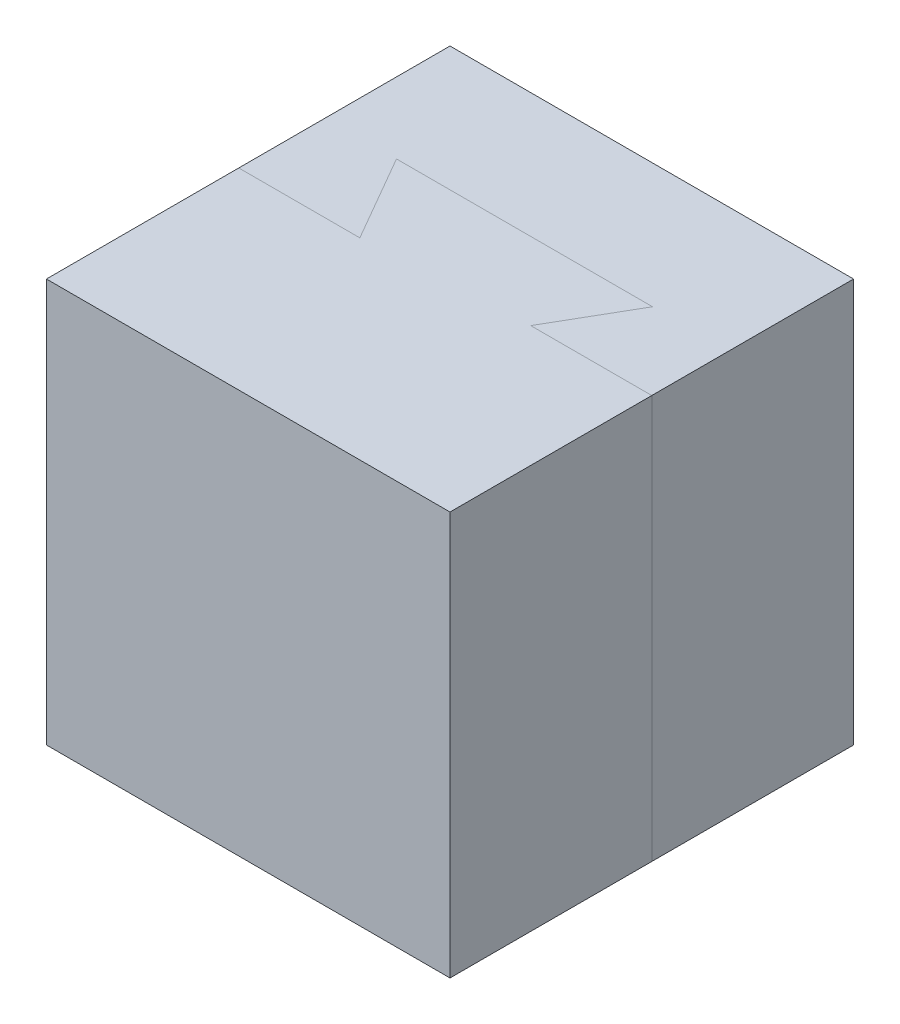
ISO-10303-21;
HEADER;
FILE_DESCRIPTION(('STEP AP214'),'2;1');
FILE_NAME('part.step','',(''),(''),'','','');
FILE_SCHEMA(('AUTOMOTIVE_DESIGN { 1 0 10303 214 1 1 1 1 }'));
ENDSEC;
DATA;
#1=APPLICATION_CONTEXT('core data for automotive mechanical design processes');
#2=APPLICATION_PROTOCOL_DEFINITION('international standard','automotive_design',2000,#1);
#3=PRODUCT_CONTEXT('',#1,'mechanical');
#4=PRODUCT('Part','Part','',(#3));
#5=PRODUCT_RELATED_PRODUCT_CATEGORY('part','',(#4));
#6=PRODUCT_DEFINITION_FORMATION('','',#4);
#7=PRODUCT_DEFINITION_CONTEXT('part definition',#1,'design');
#8=PRODUCT_DEFINITION('design','',#6,#7);
#9=PRODUCT_DEFINITION_SHAPE('','',#8);
#10=(LENGTH_UNIT() NAMED_UNIT(*) SI_UNIT(.MILLI.,.METRE.));
#11=(NAMED_UNIT(*) PLANE_ANGLE_UNIT() SI_UNIT($,.RADIAN.));
#12=(NAMED_UNIT(*) SI_UNIT($,.STERADIAN.) SOLID_ANGLE_UNIT());
#13=UNCERTAINTY_MEASURE_WITH_UNIT(LENGTH_MEASURE(1.E-05),#10,'distance_accuracy_value','');
#14=(GEOMETRIC_REPRESENTATION_CONTEXT(3) GLOBAL_UNCERTAINTY_ASSIGNED_CONTEXT((#13)) GLOBAL_UNIT_ASSIGNED_CONTEXT((#10,
#11,#12)) REPRESENTATION_CONTEXT('',''));
#15=CARTESIAN_POINT('',(0.,0.,0.));
#16=DIRECTION('',(0.,0.,1.));
#17=DIRECTION('',(1.,0.,0.));
#18=AXIS2_PLACEMENT_3D('',#15,#16,#17);
#19=CARTESIAN_POINT('',(-5.,-0.00999999999999959,0.234054964457145));
#20=DIRECTION('',(0.,0.,-1.));
#21=DIRECTION('',(-1.,0.,0.));
#22=AXIS2_PLACEMENT_3D('',#19,#20,#21);
#23=PLANE('',#22);
#24=DIRECTION('',(0.,1.,0.));
#25=VECTOR('',#24,1.);
#26=CARTESIAN_POINT('',(-2.,-0.00999999999999959,0.234054964457145));
#27=LINE('',#26,#25);
#28=CARTESIAN_POINT('',(-2.,0.,0.234054964457145));
#29=VERTEX_POINT('',#28);
#30=CARTESIAN_POINT('',(-2.,10.,0.234054964457145));
#31=VERTEX_POINT('',#30);
#32=EDGE_CURVE('E12',#29,#31,#27,.T.);
#33=ORIENTED_EDGE('',*,*,#32,.F.);
#34=DIRECTION('',(-1.,0.,0.));
#35=VECTOR('',#34,1.);
#36=CARTESIAN_POINT('',(0.,0.,0.234054964457145));
#37=LINE('',#36,#35);
#38=CARTESIAN_POINT('',(-5.,0.,0.234054964457145));
#39=VERTEX_POINT('',#38);
#40=EDGE_CURVE('E169',#29,#39,#37,.T.);
#41=ORIENTED_EDGE('',*,*,#40,.T.);
#42=DIRECTION('',(0.,1.,0.));
#43=VECTOR('',#42,1.);
#44=CARTESIAN_POINT('',(-5.,10.,0.234054964457145));
#45=LINE('',#44,#43);
#46=CARTESIAN_POINT('',(-5.,10.,0.234054964457145));
#47=VERTEX_POINT('',#46);
#48=EDGE_CURVE('E146',#39,#47,#45,.T.);
#49=ORIENTED_EDGE('',*,*,#48,.T.);
#50=DIRECTION('',(-1.,0.,0.));
#51=VECTOR('',#50,1.);
#52=CARTESIAN_POINT('',(0.,10.,0.234054964457145));
#53=LINE('',#52,#51);
#54=EDGE_CURVE('E194',#31,#47,#53,.T.);
#55=ORIENTED_EDGE('',*,*,#54,.F.);
#56=EDGE_LOOP('',(#33,#41,#49,#55));
#57=FACE_BOUND('',#56,.T.);
#58=ADVANCED_FACE('F55',(#57),#23,.T.);
#59=CARTESIAN_POINT('',(-2.,-0.00999999999999959,0.234054964457145));
#60=DIRECTION('',(-0.866025403784436,0.,0.500000000000004));
#61=DIRECTION('',(0.500000000000004,0.,0.866025403784436));
#62=AXIS2_PLACEMENT_3D('',#59,#60,#61);
#63=PLANE('',#62);
#64=DIRECTION('',(0.,1.,0.));
#65=VECTOR('',#64,1.);
#66=CARTESIAN_POINT('',(-3.2399584674678,-0.00999999999999959,-1.9136161004723));
#67=LINE('',#66,#65);
#68=CARTESIAN_POINT('',(-3.2399584674678,0.,-1.9136161004723));
#69=VERTEX_POINT('',#68);
#70=CARTESIAN_POINT('',(-3.2399584674678,10.,-1.9136161004723));
#71=VERTEX_POINT('',#70);
#72=EDGE_CURVE('E66',#69,#71,#67,.T.);
#73=ORIENTED_EDGE('',*,*,#72,.F.);
#74=DIRECTION('',(0.500000000000004,0.,0.866025403784436));
#75=VECTOR('',#74,1.);
#76=CARTESIAN_POINT('',(-1.60134877255087,0.,0.924539144898731));
#77=LINE('',#76,#75);
#78=EDGE_CURVE('E165',#69,#29,#77,.T.);
#79=ORIENTED_EDGE('',*,*,#78,.T.);
#80=ORIENTED_EDGE('',*,*,#32,.T.);
#81=DIRECTION('',(0.500000000000004,0.,0.866025403784436));
#82=VECTOR('',#81,1.);
#83=CARTESIAN_POINT('',(-1.60134877255087,10.,0.924539144898731));
#84=LINE('',#83,#82);
#85=EDGE_CURVE('E198',#71,#31,#84,.T.);
#86=ORIENTED_EDGE('',*,*,#85,.F.);
#87=EDGE_LOOP('',(#73,#79,#80,#86));
#88=FACE_BOUND('',#87,.T.);
#89=ADVANCED_FACE('F220',(#88),#63,.T.);
#90=CARTESIAN_POINT('',(-3.2399584674678,-0.00999999999999959,-1.9136161004723));
#91=DIRECTION('',(0.,0.,-1.));
#92=DIRECTION('',(-1.,0.,0.));
#93=AXIS2_PLACEMENT_3D('',#90,#91,#92);
#94=PLANE('',#93);
#95=DIRECTION('',(0.,1.,0.));
#96=VECTOR('',#95,1.);
#97=CARTESIAN_POINT('',(3.1048267707333,-0.00999999999999959,-1.9136161004723));
#98=LINE('',#97,#96);
#99=CARTESIAN_POINT('',(3.1048267707333,0.,-1.9136161004723));
#100=VERTEX_POINT('',#99);
#101=CARTESIAN_POINT('',(3.1048267707333,10.,-1.9136161004723));
#102=VERTEX_POINT('',#101);
#103=EDGE_CURVE('E189',#100,#102,#98,.T.);
#104=ORIENTED_EDGE('',*,*,#103,.F.);
#105=DIRECTION('',(-1.,0.,0.));
#106=VECTOR('',#105,1.);
#107=CARTESIAN_POINT('',(0.,0.,-1.9136161004723));
#108=LINE('',#107,#106);
#109=EDGE_CURVE('E159',#100,#69,#108,.T.);
#110=ORIENTED_EDGE('',*,*,#109,.T.);
#111=ORIENTED_EDGE('',*,*,#72,.T.);
#112=DIRECTION('',(-1.,0.,0.));
#113=VECTOR('',#112,1.);
#114=CARTESIAN_POINT('',(0.,10.,-1.9136161004723));
#115=LINE('',#114,#113);
#116=EDGE_CURVE('E202',#102,#71,#115,.T.);
#117=ORIENTED_EDGE('',*,*,#116,.F.);
#118=EDGE_LOOP('',(#104,#110,#111,#117));
#119=FACE_BOUND('',#118,.T.);
#120=ADVANCED_FACE('F216',(#119),#94,.T.);
#121=CARTESIAN_POINT('',(3.1048267707333,-0.00999999999999959,-1.9136161004723));
#122=DIRECTION('',(0.866025403784436,0.,0.500000000000004));
#123=DIRECTION('',(0.500000000000004,0.,-0.866025403784436));
#124=AXIS2_PLACEMENT_3D('',#121,#122,#123);
#125=PLANE('',#124);
#126=DIRECTION('',(0.,1.,0.));
#127=VECTOR('',#126,1.);
#128=CARTESIAN_POINT('',(2.,-0.00999999999999959,0.));
#129=LINE('',#128,#127);
#130=CARTESIAN_POINT('',(2.,0.,0.));
#131=VERTEX_POINT('',#130);
#132=CARTESIAN_POINT('',(2.,10.,0.));
#133=VERTEX_POINT('',#132);
#134=EDGE_CURVE('E138',#131,#133,#129,.T.);
#135=ORIENTED_EDGE('',*,*,#134,.F.);
#136=DIRECTION('',(0.500000000000004,0.,-0.866025403784436));
#137=VECTOR('',#136,1.);
#138=CARTESIAN_POINT('',(1.49999999999999,0.,0.866025403784443));
#139=LINE('',#138,#137);
#140=EDGE_CURVE('E152',#131,#100,#139,.T.);
#141=ORIENTED_EDGE('',*,*,#140,.T.);
#142=ORIENTED_EDGE('',*,*,#103,.T.);
#143=DIRECTION('',(0.500000000000004,0.,-0.866025403784436));
#144=VECTOR('',#143,1.);
#145=CARTESIAN_POINT('',(1.49999999999999,10.,0.866025403784443));
#146=LINE('',#145,#144);
#147=EDGE_CURVE('E206',#133,#102,#146,.T.);
#148=ORIENTED_EDGE('',*,*,#147,.F.);
#149=EDGE_LOOP('',(#135,#141,#142,#148));
#150=FACE_BOUND('',#149,.T.);
#151=ADVANCED_FACE('F214',(#150),#125,.T.);
#152=CARTESIAN_POINT('',(2.,-0.00999999999999959,0.));
#153=DIRECTION('',(0.,0.,-1.));
#154=DIRECTION('',(-1.,0.,0.));
#155=AXIS2_PLACEMENT_3D('',#152,#153,#154);
#156=PLANE('',#155);
#157=DIRECTION('',(0.,-1.,0.));
#158=VECTOR('',#157,1.);
#159=CARTESIAN_POINT('',(5.,10.,0.));
#160=LINE('',#159,#158);
#161=CARTESIAN_POINT('',(5.,10.,0.));
#162=VERTEX_POINT('',#161);
#163=CARTESIAN_POINT('',(5.,0.,0.));
#164=VERTEX_POINT('',#163);
#165=EDGE_CURVE('E132',#162,#164,#160,.T.);
#166=ORIENTED_EDGE('',*,*,#165,.T.);
#167=DIRECTION('',(-1.,0.,0.));
#168=VECTOR('',#167,1.);
#169=CARTESIAN_POINT('',(0.,0.,0.));
#170=LINE('',#169,#168);
#171=EDGE_CURVE('E142',#164,#131,#170,.T.);
#172=ORIENTED_EDGE('',*,*,#171,.T.);
#173=ORIENTED_EDGE('',*,*,#134,.T.);
#174=DIRECTION('',(-1.,0.,0.));
#175=VECTOR('',#174,1.);
#176=CARTESIAN_POINT('',(0.,10.,0.));
#177=LINE('',#176,#175);
#178=EDGE_CURVE('E144',#162,#133,#177,.T.);
#179=ORIENTED_EDGE('',*,*,#178,.F.);
#180=EDGE_LOOP('',(#166,#172,#173,#179));
#181=FACE_BOUND('',#180,.T.);
#182=ADVANCED_FACE('F141',(#181),#156,.T.);
#183=CARTESIAN_POINT('',(0.,0.,0.));
#184=DIRECTION('',(0.,1.,0.));
#185=DIRECTION('',(0.,0.,1.));
#186=AXIS2_PLACEMENT_3D('',#183,#184,#185);
#187=PLANE('',#186);
#188=ORIENTED_EDGE('',*,*,#171,.F.);
#189=DIRECTION('',(0.,0.,-1.));
#190=VECTOR('',#189,1.);
#191=CARTESIAN_POINT('',(5.,0.,-5.));
#192=LINE('',#191,#190);
#193=CARTESIAN_POINT('',(5.,0.,5.));
#194=VERTEX_POINT('',#193);
#195=EDGE_CURVE('E59',#194,#164,#192,.T.);
#196=ORIENTED_EDGE('',*,*,#195,.F.);
#197=DIRECTION('',(1.,0.,0.));
#198=VECTOR('',#197,1.);
#199=CARTESIAN_POINT('',(-5.,0.,5.));
#200=LINE('',#199,#198);
#201=CARTESIAN_POINT('',(-5.,0.,5.));
#202=VERTEX_POINT('',#201);
#203=EDGE_CURVE('E177',#202,#194,#200,.T.);
#204=ORIENTED_EDGE('',*,*,#203,.F.);
#205=DIRECTION('',(0.,0.,1.));
#206=VECTOR('',#205,1.);
#207=CARTESIAN_POINT('',(-5.,0.,-5.));
#208=LINE('',#207,#206);
#209=EDGE_CURVE('E75',#39,#202,#208,.T.);
#210=ORIENTED_EDGE('',*,*,#209,.F.);
#211=ORIENTED_EDGE('',*,*,#40,.F.);
#212=ORIENTED_EDGE('',*,*,#78,.F.);
#213=ORIENTED_EDGE('',*,*,#109,.F.);
#214=ORIENTED_EDGE('',*,*,#140,.F.);
#215=EDGE_LOOP('',(#188,#196,#204,#210,#211,#212,#213,#214));
#216=FACE_BOUND('',#215,.T.);
#217=ADVANCED_FACE('F149',(#216),#187,.F.);
#218=CARTESIAN_POINT('',(5.,10.,-5.));
#219=DIRECTION('',(-1.,0.,0.));
#220=DIRECTION('',(0.,0.,1.));
#221=AXIS2_PLACEMENT_3D('',#218,#219,#220);
#222=PLANE('',#221);
#223=ORIENTED_EDGE('',*,*,#165,.F.);
#224=DIRECTION('',(0.,0.,-1.));
#225=VECTOR('',#224,1.);
#226=CARTESIAN_POINT('',(5.,10.,-5.));
#227=LINE('',#226,#225);
#228=CARTESIAN_POINT('',(5.,10.,5.));
#229=VERTEX_POINT('',#228);
#230=EDGE_CURVE('E175',#229,#162,#227,.T.);
#231=ORIENTED_EDGE('',*,*,#230,.F.);
#232=DIRECTION('',(0.,-1.,0.));
#233=VECTOR('',#232,1.);
#234=CARTESIAN_POINT('',(5.,10.,5.));
#235=LINE('',#234,#233);
#236=EDGE_CURVE('E133',#229,#194,#235,.T.);
#237=ORIENTED_EDGE('',*,*,#236,.T.);
#238=ORIENTED_EDGE('',*,*,#195,.T.);
#239=EDGE_LOOP('',(#223,#231,#237,#238));
#240=FACE_BOUND('',#239,.T.);
#241=ADVANCED_FACE('F130',(#240),#222,.F.);
#242=CARTESIAN_POINT('',(-5.,10.,5.));
#243=DIRECTION('',(0.,0.,-1.));
#244=DIRECTION('',(-1.,0.,0.));
#245=AXIS2_PLACEMENT_3D('',#242,#243,#244);
#246=PLANE('',#245);
#247=ORIENTED_EDGE('',*,*,#203,.T.);
#248=ORIENTED_EDGE('',*,*,#236,.F.);
#249=DIRECTION('',(1.,0.,0.));
#250=VECTOR('',#249,1.);
#251=CARTESIAN_POINT('',(-5.,10.,5.));
#252=LINE('',#251,#250);
#253=CARTESIAN_POINT('',(-5.,10.,5.));
#254=VERTEX_POINT('',#253);
#255=EDGE_CURVE('E87',#254,#229,#252,.T.);
#256=ORIENTED_EDGE('',*,*,#255,.F.);
#257=DIRECTION('',(0.,-1.,0.));
#258=VECTOR('',#257,1.);
#259=CARTESIAN_POINT('',(-5.,10.,5.));
#260=LINE('',#259,#258);
#261=EDGE_CURVE('E197',#254,#202,#260,.T.);
#262=ORIENTED_EDGE('',*,*,#261,.T.);
#263=EDGE_LOOP('',(#247,#248,#256,#262));
#264=FACE_BOUND('',#263,.T.);
#265=ADVANCED_FACE('F224',(#264),#246,.F.);
#266=CARTESIAN_POINT('',(-5.,10.,-5.));
#267=DIRECTION('',(1.,0.,0.));
#268=DIRECTION('',(0.,0.,-1.));
#269=AXIS2_PLACEMENT_3D('',#266,#267,#268);
#270=PLANE('',#269);
#271=ORIENTED_EDGE('',*,*,#48,.F.);
#272=ORIENTED_EDGE('',*,*,#209,.T.);
#273=ORIENTED_EDGE('',*,*,#261,.F.);
#274=DIRECTION('',(0.,0.,1.));
#275=VECTOR('',#274,1.);
#276=CARTESIAN_POINT('',(-5.,10.,-5.));
#277=LINE('',#276,#275);
#278=EDGE_CURVE('E172',#47,#254,#277,.T.);
#279=ORIENTED_EDGE('',*,*,#278,.F.);
#280=EDGE_LOOP('',(#271,#272,#273,#279));
#281=FACE_BOUND('',#280,.T.);
#282=ADVANCED_FACE('F222',(#281),#270,.F.);
#283=CARTESIAN_POINT('',(0.,10.,0.));
#284=DIRECTION('',(0.,1.,0.));
#285=DIRECTION('',(0.,0.,1.));
#286=AXIS2_PLACEMENT_3D('',#283,#284,#285);
#287=PLANE('',#286);
#288=ORIENTED_EDGE('',*,*,#230,.T.);
#289=ORIENTED_EDGE('',*,*,#178,.T.);
#290=ORIENTED_EDGE('',*,*,#147,.T.);
#291=ORIENTED_EDGE('',*,*,#116,.T.);
#292=ORIENTED_EDGE('',*,*,#85,.T.);
#293=ORIENTED_EDGE('',*,*,#54,.T.);
#294=ORIENTED_EDGE('',*,*,#278,.T.);
#295=ORIENTED_EDGE('',*,*,#255,.T.);
#296=EDGE_LOOP('',(#288,#289,#290,#291,#292,#293,#294,#295));
#297=FACE_BOUND('',#296,.T.);
#298=ADVANCED_FACE('F57',(#297),#287,.T.);
#299=CLOSED_SHELL('',(#58,#89,#120,#151,#182,#217,#241,#265,#282,#298));
#300=MANIFOLD_SOLID_BREP('B2',#299);
#301=CARTESIAN_POINT('',(-5.,-0.00999999999999959,0.234054964457145));
#302=DIRECTION('',(0.,0.,-1.));
#303=DIRECTION('',(-1.,0.,0.));
#304=AXIS2_PLACEMENT_3D('',#301,#302,#303);
#305=PLANE('',#304);
#306=DIRECTION('',(0.,1.,0.));
#307=VECTOR('',#306,1.);
#308=CARTESIAN_POINT('',(-2.,-0.00999999999999959,0.234054964457145));
#309=LINE('',#308,#307);
#310=CARTESIAN_POINT('',(-2.,0.,0.234054964457145));
#311=VERTEX_POINT('',#310);
#312=CARTESIAN_POINT('',(-2.,10.,0.234054964457145));
#313=VERTEX_POINT('',#312);
#314=EDGE_CURVE('E53',#311,#313,#309,.T.);
#315=ORIENTED_EDGE('',*,*,#314,.T.);
#316=DIRECTION('',(-1.,0.,0.));
#317=VECTOR('',#316,1.);
#318=CARTESIAN_POINT('',(0.,10.,0.234054964457145));
#319=LINE('',#318,#317);
#320=CARTESIAN_POINT('',(-5.,10.,0.234054964457145));
#321=VERTEX_POINT('',#320);
#322=EDGE_CURVE('E404',#313,#321,#319,.T.);
#323=ORIENTED_EDGE('',*,*,#322,.T.);
#324=DIRECTION('',(0.,1.,0.));
#325=VECTOR('',#324,1.);
#326=CARTESIAN_POINT('',(-5.,10.,0.234054964457145));
#327=LINE('',#326,#325);
#328=CARTESIAN_POINT('',(-5.,0.,0.234054964457145));
#329=VERTEX_POINT('',#328);
#330=EDGE_CURVE('E403',#329,#321,#327,.T.);
#331=ORIENTED_EDGE('',*,*,#330,.F.);
#332=DIRECTION('',(-1.,0.,0.));
#333=VECTOR('',#332,1.);
#334=CARTESIAN_POINT('',(0.,0.,0.234054964457145));
#335=LINE('',#334,#333);
#336=EDGE_CURVE('E311',#311,#329,#335,.T.);
#337=ORIENTED_EDGE('',*,*,#336,.F.);
#338=EDGE_LOOP('',(#315,#323,#331,#337));
#339=FACE_BOUND('',#338,.T.);
#340=ADVANCED_FACE('F297',(#339),#305,.F.);
#341=CARTESIAN_POINT('',(-2.,-0.00999999999999959,0.234054964457145));
#342=DIRECTION('',(-0.866025403784436,0.,0.500000000000004));
#343=DIRECTION('',(0.500000000000004,0.,0.866025403784436));
#344=AXIS2_PLACEMENT_3D('',#341,#342,#343);
#345=PLANE('',#344);
#346=DIRECTION('',(0.,1.,0.));
#347=VECTOR('',#346,1.);
#348=CARTESIAN_POINT('',(-3.2399584674678,-0.00999999999999959,-1.9136161004723));
#349=LINE('',#348,#347);
#350=CARTESIAN_POINT('',(-3.2399584674678,0.,-1.9136161004723));
#351=VERTEX_POINT('',#350);
#352=CARTESIAN_POINT('',(-3.2399584674678,10.,-1.9136161004723));
#353=VERTEX_POINT('',#352);
#354=EDGE_CURVE('E305',#351,#353,#349,.T.);
#355=ORIENTED_EDGE('',*,*,#354,.T.);
#356=DIRECTION('',(0.500000000000004,0.,0.866025403784436));
#357=VECTOR('',#356,1.);
#358=CARTESIAN_POINT('',(-1.60134877255087,10.,0.924539144898731));
#359=LINE('',#358,#357);
#360=EDGE_CURVE('E408',#353,#313,#359,.T.);
#361=ORIENTED_EDGE('',*,*,#360,.T.);
#362=ORIENTED_EDGE('',*,*,#314,.F.);
#363=DIRECTION('',(0.500000000000004,0.,0.866025403784436));
#364=VECTOR('',#363,1.);
#365=CARTESIAN_POINT('',(-1.60134877255087,0.,0.924539144898731));
#366=LINE('',#365,#364);
#367=EDGE_CURVE('E318',#351,#311,#366,.T.);
#368=ORIENTED_EDGE('',*,*,#367,.F.);
#369=EDGE_LOOP('',(#355,#361,#362,#368));
#370=FACE_BOUND('',#369,.T.);
#371=ADVANCED_FACE('F426',(#370),#345,.F.);
#372=CARTESIAN_POINT('',(-3.2399584674678,-0.00999999999999959,-1.9136161004723));
#373=DIRECTION('',(0.,0.,-1.));
#374=DIRECTION('',(-1.,0.,0.));
#375=AXIS2_PLACEMENT_3D('',#372,#373,#374);
#376=PLANE('',#375);
#377=DIRECTION('',(0.,1.,0.));
#378=VECTOR('',#377,1.);
#379=CARTESIAN_POINT('',(3.1048267707333,-0.00999999999999959,-1.9136161004723));
#380=LINE('',#379,#378);
#381=CARTESIAN_POINT('',(3.1048267707333,0.,-1.9136161004723));
#382=VERTEX_POINT('',#381);
#383=CARTESIAN_POINT('',(3.1048267707333,10.,-1.9136161004723));
#384=VERTEX_POINT('',#383);
#385=EDGE_CURVE('E423',#382,#384,#380,.T.);
#386=ORIENTED_EDGE('',*,*,#385,.T.);
#387=DIRECTION('',(-1.,0.,0.));
#388=VECTOR('',#387,1.);
#389=CARTESIAN_POINT('',(0.,10.,-1.9136161004723));
#390=LINE('',#389,#388);
#391=EDGE_CURVE('E411',#384,#353,#390,.T.);
#392=ORIENTED_EDGE('',*,*,#391,.T.);
#393=ORIENTED_EDGE('',*,*,#354,.F.);
#394=DIRECTION('',(-1.,0.,0.));
#395=VECTOR('',#394,1.);
#396=CARTESIAN_POINT('',(0.,0.,-1.9136161004723));
#397=LINE('',#396,#395);
#398=EDGE_CURVE('E395',#382,#351,#397,.T.);
#399=ORIENTED_EDGE('',*,*,#398,.F.);
#400=EDGE_LOOP('',(#386,#392,#393,#399));
#401=FACE_BOUND('',#400,.T.);
#402=ADVANCED_FACE('F428',(#401),#376,.F.);
#403=CARTESIAN_POINT('',(3.1048267707333,-0.00999999999999959,-1.9136161004723));
#404=DIRECTION('',(0.866025403784436,0.,0.500000000000004));
#405=DIRECTION('',(0.500000000000004,0.,-0.866025403784436));
#406=AXIS2_PLACEMENT_3D('',#403,#404,#405);
#407=PLANE('',#406);
#408=DIRECTION('',(0.,1.,0.));
#409=VECTOR('',#408,1.);
#410=CARTESIAN_POINT('',(2.,-0.00999999999999959,0.));
#411=LINE('',#410,#409);
#412=CARTESIAN_POINT('',(2.,0.,0.));
#413=VERTEX_POINT('',#412);
#414=CARTESIAN_POINT('',(2.,10.,0.));
#415=VERTEX_POINT('',#414);
#416=EDGE_CURVE('E407',#413,#415,#411,.T.);
#417=ORIENTED_EDGE('',*,*,#416,.T.);
#418=DIRECTION('',(0.500000000000004,0.,-0.866025403784436));
#419=VECTOR('',#418,1.);
#420=CARTESIAN_POINT('',(1.49999999999999,10.,0.866025403784443));
#421=LINE('',#420,#419);
#422=EDGE_CURVE('E414',#415,#384,#421,.T.);
#423=ORIENTED_EDGE('',*,*,#422,.T.);
#424=ORIENTED_EDGE('',*,*,#385,.F.);
#425=DIRECTION('',(0.500000000000004,0.,-0.866025403784436));
#426=VECTOR('',#425,1.);
#427=CARTESIAN_POINT('',(1.49999999999999,0.,0.866025403784443));
#428=LINE('',#427,#426);
#429=EDGE_CURVE('E397',#413,#382,#428,.T.);
#430=ORIENTED_EDGE('',*,*,#429,.F.);
#431=EDGE_LOOP('',(#417,#423,#424,#430));
#432=FACE_BOUND('',#431,.T.);
#433=ADVANCED_FACE('F441',(#432),#407,.F.);
#434=CARTESIAN_POINT('',(2.,-0.00999999999999959,0.));
#435=DIRECTION('',(0.,0.,-1.));
#436=DIRECTION('',(-1.,0.,0.));
#437=AXIS2_PLACEMENT_3D('',#434,#435,#436);
#438=PLANE('',#437);
#439=DIRECTION('',(0.,-1.,0.));
#440=VECTOR('',#439,1.);
#441=CARTESIAN_POINT('',(5.,10.,0.));
#442=LINE('',#441,#440);
#443=CARTESIAN_POINT('',(5.,10.,0.));
#444=VERTEX_POINT('',#443);
#445=CARTESIAN_POINT('',(5.,0.,0.));
#446=VERTEX_POINT('',#445);
#447=EDGE_CURVE('E418',#444,#446,#442,.T.);
#448=ORIENTED_EDGE('',*,*,#447,.F.);
#449=DIRECTION('',(-1.,0.,0.));
#450=VECTOR('',#449,1.);
#451=CARTESIAN_POINT('',(0.,10.,0.));
#452=LINE('',#451,#450);
#453=EDGE_CURVE('E369',#444,#415,#452,.T.);
#454=ORIENTED_EDGE('',*,*,#453,.T.);
#455=ORIENTED_EDGE('',*,*,#416,.F.);
#456=DIRECTION('',(-1.,0.,0.));
#457=VECTOR('',#456,1.);
#458=CARTESIAN_POINT('',(0.,0.,0.));
#459=LINE('',#458,#457);
#460=EDGE_CURVE('E400',#446,#413,#459,.T.);
#461=ORIENTED_EDGE('',*,*,#460,.F.);
#462=EDGE_LOOP('',(#448,#454,#455,#461));
#463=FACE_BOUND('',#462,.T.);
#464=ADVANCED_FACE('F299',(#463),#438,.F.);
#465=CARTESIAN_POINT('',(-5.,10.,-5.));
#466=DIRECTION('',(0.,0.,1.));
#467=DIRECTION('',(1.,0.,0.));
#468=AXIS2_PLACEMENT_3D('',#465,#466,#467);
#469=PLANE('',#468);
#470=DIRECTION('',(-1.,0.,0.));
#471=VECTOR('',#470,1.);
#472=CARTESIAN_POINT('',(-5.,0.,-5.));
#473=LINE('',#472,#471);
#474=CARTESIAN_POINT('',(5.,0.,-5.));
#475=VERTEX_POINT('',#474);
#476=CARTESIAN_POINT('',(-5.,0.,-5.));
#477=VERTEX_POINT('',#476);
#478=EDGE_CURVE('E452',#475,#477,#473,.T.);
#479=ORIENTED_EDGE('',*,*,#478,.T.);
#480=DIRECTION('',(0.,-1.,0.));
#481=VECTOR('',#480,1.);
#482=CARTESIAN_POINT('',(-5.,10.,-5.));
#483=LINE('',#482,#481);
#484=CARTESIAN_POINT('',(-5.,10.,-5.));
#485=VERTEX_POINT('',#484);
#486=EDGE_CURVE('E381',#485,#477,#483,.T.);
#487=ORIENTED_EDGE('',*,*,#486,.F.);
#488=DIRECTION('',(-1.,0.,0.));
#489=VECTOR('',#488,1.);
#490=CARTESIAN_POINT('',(-5.,10.,-5.));
#491=LINE('',#490,#489);
#492=CARTESIAN_POINT('',(5.,10.,-5.));
#493=VERTEX_POINT('',#492);
#494=EDGE_CURVE('E366',#493,#485,#491,.T.);
#495=ORIENTED_EDGE('',*,*,#494,.F.);
#496=DIRECTION('',(0.,-1.,0.));
#497=VECTOR('',#496,1.);
#498=CARTESIAN_POINT('',(5.,10.,-5.));
#499=LINE('',#498,#497);
#500=EDGE_CURVE('E379',#493,#475,#499,.T.);
#501=ORIENTED_EDGE('',*,*,#500,.T.);
#502=EDGE_LOOP('',(#479,#487,#495,#501));
#503=FACE_BOUND('',#502,.T.);
#504=ADVANCED_FACE('F378',(#503),#469,.F.);
#505=CARTESIAN_POINT('',(-5.,10.,-5.));
#506=DIRECTION('',(1.,0.,0.));
#507=DIRECTION('',(0.,0.,-1.));
#508=AXIS2_PLACEMENT_3D('',#505,#506,#507);
#509=PLANE('',#508);
#510=DIRECTION('',(0.,0.,1.));
#511=VECTOR('',#510,1.);
#512=CARTESIAN_POINT('',(-5.,0.,-5.));
#513=LINE('',#512,#511);
#514=EDGE_CURVE('E374',#477,#329,#513,.T.);
#515=ORIENTED_EDGE('',*,*,#514,.T.);
#516=ORIENTED_EDGE('',*,*,#330,.T.);
#517=DIRECTION('',(0.,0.,1.));
#518=VECTOR('',#517,1.);
#519=CARTESIAN_POINT('',(-5.,10.,-5.));
#520=LINE('',#519,#518);
#521=EDGE_CURVE('E383',#485,#321,#520,.T.);
#522=ORIENTED_EDGE('',*,*,#521,.F.);
#523=ORIENTED_EDGE('',*,*,#486,.T.);
#524=EDGE_LOOP('',(#515,#516,#522,#523));
#525=FACE_BOUND('',#524,.T.);
#526=ADVANCED_FACE('F458',(#525),#509,.F.);
#527=CARTESIAN_POINT('',(5.,10.,-5.));
#528=DIRECTION('',(-1.,0.,0.));
#529=DIRECTION('',(0.,0.,1.));
#530=AXIS2_PLACEMENT_3D('',#527,#528,#529);
#531=PLANE('',#530);
#532=DIRECTION('',(0.,0.,-1.));
#533=VECTOR('',#532,1.);
#534=CARTESIAN_POINT('',(5.,10.,-5.));
#535=LINE('',#534,#533);
#536=EDGE_CURVE('E362',#444,#493,#535,.T.);
#537=ORIENTED_EDGE('',*,*,#536,.F.);
#538=ORIENTED_EDGE('',*,*,#447,.T.);
#539=DIRECTION('',(0.,0.,-1.));
#540=VECTOR('',#539,1.);
#541=CARTESIAN_POINT('',(5.,0.,-5.));
#542=LINE('',#541,#540);
#543=EDGE_CURVE('E387',#446,#475,#542,.T.);
#544=ORIENTED_EDGE('',*,*,#543,.T.);
#545=ORIENTED_EDGE('',*,*,#500,.F.);
#546=EDGE_LOOP('',(#537,#538,#544,#545));
#547=FACE_BOUND('',#546,.T.);
#548=ADVANCED_FACE('F385',(#547),#531,.F.);
#549=CARTESIAN_POINT('',(0.,0.,0.));
#550=DIRECTION('',(0.,1.,0.));
#551=DIRECTION('',(0.,0.,1.));
#552=AXIS2_PLACEMENT_3D('',#549,#550,#551);
#553=PLANE('',#552);
#554=ORIENTED_EDGE('',*,*,#543,.F.);
#555=ORIENTED_EDGE('',*,*,#460,.T.);
#556=ORIENTED_EDGE('',*,*,#429,.T.);
#557=ORIENTED_EDGE('',*,*,#398,.T.);
#558=ORIENTED_EDGE('',*,*,#367,.T.);
#559=ORIENTED_EDGE('',*,*,#336,.T.);
#560=ORIENTED_EDGE('',*,*,#514,.F.);
#561=ORIENTED_EDGE('',*,*,#478,.F.);
#562=EDGE_LOOP('',(#554,#555,#556,#557,#558,#559,#560,#561));
#563=FACE_BOUND('',#562,.T.);
#564=ADVANCED_FACE('F450',(#563),#553,.F.);
#565=CARTESIAN_POINT('',(0.,10.,0.));
#566=DIRECTION('',(0.,1.,0.));
#567=DIRECTION('',(0.,0.,1.));
#568=AXIS2_PLACEMENT_3D('',#565,#566,#567);
#569=PLANE('',#568);
#570=ORIENTED_EDGE('',*,*,#453,.F.);
#571=ORIENTED_EDGE('',*,*,#536,.T.);
#572=ORIENTED_EDGE('',*,*,#494,.T.);
#573=ORIENTED_EDGE('',*,*,#521,.T.);
#574=ORIENTED_EDGE('',*,*,#322,.F.);
#575=ORIENTED_EDGE('',*,*,#360,.F.);
#576=ORIENTED_EDGE('',*,*,#391,.F.);
#577=ORIENTED_EDGE('',*,*,#422,.F.);
#578=EDGE_LOOP('',(#570,#571,#572,#573,#574,#575,#576,#577));
#579=FACE_BOUND('',#578,.T.);
#580=ADVANCED_FACE('F364',(#579),#569,.T.);
#581=CLOSED_SHELL('',(#340,#371,#402,#433,#464,#504,#526,#548,#564,#580));
#582=MANIFOLD_SOLID_BREP('B6',#581);
#583=ADVANCED_BREP_SHAPE_REPRESENTATION('',(#18,#300,#582),#14);
#584=SHAPE_DEFINITION_REPRESENTATION(#9,#583);
ENDSEC;
END-ISO-10303-21;
